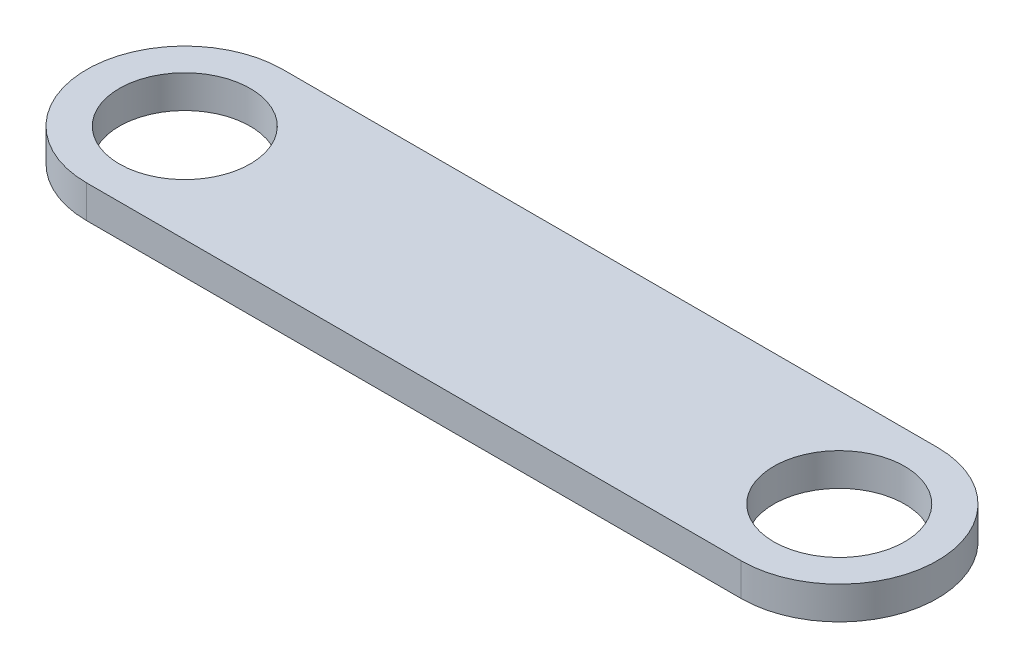
ISO-10303-21;
HEADER;
FILE_DESCRIPTION(('STEP AP214'),'2;1');
FILE_NAME('part.step','',(''),(''),'','','');
FILE_SCHEMA(('AUTOMOTIVE_DESIGN { 1 0 10303 214 1 1 1 1 }'));
ENDSEC;
DATA;
#1=APPLICATION_CONTEXT('core data for automotive mechanical design processes');
#2=APPLICATION_PROTOCOL_DEFINITION('international standard','automotive_design',2000,#1);
#3=PRODUCT_CONTEXT('',#1,'mechanical');
#4=PRODUCT('Part','Part','',(#3));
#5=PRODUCT_RELATED_PRODUCT_CATEGORY('part','',(#4));
#6=PRODUCT_DEFINITION_FORMATION('','',#4);
#7=PRODUCT_DEFINITION_CONTEXT('part definition',#1,'design');
#8=PRODUCT_DEFINITION('design','',#6,#7);
#9=PRODUCT_DEFINITION_SHAPE('','',#8);
#10=(LENGTH_UNIT() NAMED_UNIT(*) SI_UNIT(.MILLI.,.METRE.));
#11=(NAMED_UNIT(*) PLANE_ANGLE_UNIT() SI_UNIT($,.RADIAN.));
#12=(NAMED_UNIT(*) SI_UNIT($,.STERADIAN.) SOLID_ANGLE_UNIT());
#13=UNCERTAINTY_MEASURE_WITH_UNIT(LENGTH_MEASURE(1.E-05),#10,'distance_accuracy_value','');
#14=(GEOMETRIC_REPRESENTATION_CONTEXT(3) GLOBAL_UNCERTAINTY_ASSIGNED_CONTEXT((#13)) GLOBAL_UNIT_ASSIGNED_CONTEXT((#10,
#11,#12)) REPRESENTATION_CONTEXT('',''));
#15=CARTESIAN_POINT('',(0.,0.,0.));
#16=DIRECTION('',(0.,0.,1.));
#17=DIRECTION('',(1.,0.,0.));
#18=AXIS2_PLACEMENT_3D('',#15,#16,#17);
#19=CARTESIAN_POINT('',(0.,5.,15.));
#20=DIRECTION('',(0.,0.,-1.));
#21=DIRECTION('',(-1.,0.,0.));
#22=AXIS2_PLACEMENT_3D('',#19,#20,#21);
#23=PLANE('',#22);
#24=DIRECTION('',(1.,0.,0.));
#25=VECTOR('',#24,1.);
#26=CARTESIAN_POINT('',(0.,0.,15.));
#27=LINE('',#26,#25);
#28=CARTESIAN_POINT('',(0.,0.,15.));
#29=VERTEX_POINT('',#28);
#30=CARTESIAN_POINT('',(100.,0.,15.));
#31=VERTEX_POINT('',#30);
#32=EDGE_CURVE('E123',#29,#31,#27,.T.);
#33=ORIENTED_EDGE('',*,*,#32,.T.);
#34=DIRECTION('',(0.,-1.,0.));
#35=VECTOR('',#34,1.);
#36=CARTESIAN_POINT('',(100.,5.,15.));
#37=LINE('',#36,#35);
#38=CARTESIAN_POINT('',(100.,5.,15.));
#39=VERTEX_POINT('',#38);
#40=EDGE_CURVE('E11',#39,#31,#37,.T.);
#41=ORIENTED_EDGE('',*,*,#40,.F.);
#42=DIRECTION('',(1.,0.,0.));
#43=VECTOR('',#42,1.);
#44=CARTESIAN_POINT('',(0.,5.,15.));
#45=LINE('',#44,#43);
#46=CARTESIAN_POINT('',(0.,5.,15.));
#47=VERTEX_POINT('',#46);
#48=EDGE_CURVE('E96',#47,#39,#45,.T.);
#49=ORIENTED_EDGE('',*,*,#48,.F.);
#50=DIRECTION('',(0.,-1.,0.));
#51=VECTOR('',#50,1.);
#52=CARTESIAN_POINT('',(0.,5.,15.));
#53=LINE('',#52,#51);
#54=EDGE_CURVE('E111',#47,#29,#53,.T.);
#55=ORIENTED_EDGE('',*,*,#54,.T.);
#56=EDGE_LOOP('',(#33,#41,#49,#55));
#57=FACE_BOUND('',#56,.T.);
#58=ADVANCED_FACE('F47',(#57),#23,.F.);
#59=CARTESIAN_POINT('',(100.,5.,0.));
#60=DIRECTION('',(0.,-1.,0.));
#61=DIRECTION('',(0.,0.,-1.));
#62=AXIS2_PLACEMENT_3D('',#59,#60,#61);
#63=CYLINDRICAL_SURFACE('',#62,15.);
#64=CARTESIAN_POINT('',(100.,0.,0.));
#65=DIRECTION('',(0.,1.,0.));
#66=DIRECTION('',(0.,0.,1.));
#67=AXIS2_PLACEMENT_3D('',#64,#65,#66);
#68=CIRCLE('',#67,15.);
#69=CARTESIAN_POINT('',(100.,0.,-15.));
#70=VERTEX_POINT('',#69);
#71=EDGE_CURVE('E102',#31,#70,#68,.T.);
#72=ORIENTED_EDGE('',*,*,#71,.T.);
#73=DIRECTION('',(0.,-1.,0.));
#74=VECTOR('',#73,1.);
#75=CARTESIAN_POINT('',(100.,5.,-15.));
#76=LINE('',#75,#74);
#77=CARTESIAN_POINT('',(100.,5.,-15.));
#78=VERTEX_POINT('',#77);
#79=EDGE_CURVE('E57',#78,#70,#76,.T.);
#80=ORIENTED_EDGE('',*,*,#79,.F.);
#81=CARTESIAN_POINT('',(100.,5.,0.));
#82=DIRECTION('',(0.,1.,0.));
#83=DIRECTION('',(0.,0.,1.));
#84=AXIS2_PLACEMENT_3D('',#81,#82,#83);
#85=CIRCLE('',#84,15.);
#86=EDGE_CURVE('E91',#39,#78,#85,.T.);
#87=ORIENTED_EDGE('',*,*,#86,.F.);
#88=ORIENTED_EDGE('',*,*,#40,.T.);
#89=EDGE_LOOP('',(#72,#80,#87,#88));
#90=FACE_BOUND('',#89,.T.);
#91=ADVANCED_FACE('F101',(#90),#63,.T.);
#92=CARTESIAN_POINT('',(0.,5.,-15.));
#93=DIRECTION('',(0.,0.,-1.));
#94=DIRECTION('',(-1.,0.,0.));
#95=AXIS2_PLACEMENT_3D('',#92,#93,#94);
#96=PLANE('',#95);
#97=DIRECTION('',(1.,0.,0.));
#98=VECTOR('',#97,1.);
#99=CARTESIAN_POINT('',(0.,0.,-15.));
#100=LINE('',#99,#98);
#101=CARTESIAN_POINT('',(0.,0.,-15.));
#102=VERTEX_POINT('',#101);
#103=EDGE_CURVE('E129',#102,#70,#100,.T.);
#104=ORIENTED_EDGE('',*,*,#103,.F.);
#105=DIRECTION('',(0.,-1.,0.));
#106=VECTOR('',#105,1.);
#107=CARTESIAN_POINT('',(0.,5.,-15.));
#108=LINE('',#107,#106);
#109=CARTESIAN_POINT('',(0.,5.,-15.));
#110=VERTEX_POINT('',#109);
#111=EDGE_CURVE('E81',#110,#102,#108,.T.);
#112=ORIENTED_EDGE('',*,*,#111,.F.);
#113=DIRECTION('',(1.,0.,0.));
#114=VECTOR('',#113,1.);
#115=CARTESIAN_POINT('',(0.,5.,-15.));
#116=LINE('',#115,#114);
#117=EDGE_CURVE('E94',#110,#78,#116,.T.);
#118=ORIENTED_EDGE('',*,*,#117,.T.);
#119=ORIENTED_EDGE('',*,*,#79,.T.);
#120=EDGE_LOOP('',(#104,#112,#118,#119));
#121=FACE_BOUND('',#120,.T.);
#122=ADVANCED_FACE('F107',(#121),#96,.T.);
#123=CARTESIAN_POINT('',(0.,5.,0.));
#124=DIRECTION('',(0.,-1.,0.));
#125=DIRECTION('',(0.,0.,-1.));
#126=AXIS2_PLACEMENT_3D('',#123,#124,#125);
#127=CYLINDRICAL_SURFACE('',#126,10.);
#128=CARTESIAN_POINT('',(0.,5.,0.));
#129=DIRECTION('',(0.,1.,0.));
#130=DIRECTION('',(0.,0.,1.));
#131=AXIS2_PLACEMENT_3D('',#128,#129,#130);
#132=CIRCLE('',#131,10.);
#133=CARTESIAN_POINT('',(0.,5.,10.));
#134=VERTEX_POINT('',#133);
#135=EDGE_CURVE('E171',#134,#134,#132,.T.);
#136=ORIENTED_EDGE('',*,*,#135,.T.);
#137=EDGE_LOOP('',(#136));
#138=FACE_BOUND('',#137,.T.);
#139=CARTESIAN_POINT('',(0.,0.,0.));
#140=DIRECTION('',(0.,1.,0.));
#141=DIRECTION('',(0.,0.,1.));
#142=AXIS2_PLACEMENT_3D('',#139,#140,#141);
#143=CIRCLE('',#142,10.);
#144=CARTESIAN_POINT('',(0.,0.,10.));
#145=VERTEX_POINT('',#144);
#146=EDGE_CURVE('E119',#145,#145,#143,.T.);
#147=ORIENTED_EDGE('',*,*,#146,.F.);
#148=EDGE_LOOP('',(#147));
#149=FACE_BOUND('',#148,.T.);
#150=ADVANCED_FACE('F160',(#138,#149),#127,.F.);
#151=CARTESIAN_POINT('',(100.,5.,0.));
#152=DIRECTION('',(0.,-1.,0.));
#153=DIRECTION('',(0.,0.,-1.));
#154=AXIS2_PLACEMENT_3D('',#151,#152,#153);
#155=CYLINDRICAL_SURFACE('',#154,10.);
#156=CARTESIAN_POINT('',(100.,5.,0.));
#157=DIRECTION('',(0.,1.,0.));
#158=DIRECTION('',(0.,0.,1.));
#159=AXIS2_PLACEMENT_3D('',#156,#157,#158);
#160=CIRCLE('',#159,10.);
#161=CARTESIAN_POINT('',(100.,5.,10.));
#162=VERTEX_POINT('',#161);
#163=EDGE_CURVE('E134',#162,#162,#160,.T.);
#164=ORIENTED_EDGE('',*,*,#163,.T.);
#165=EDGE_LOOP('',(#164));
#166=FACE_BOUND('',#165,.T.);
#167=CARTESIAN_POINT('',(100.,0.,0.));
#168=DIRECTION('',(0.,1.,0.));
#169=DIRECTION('',(0.,0.,1.));
#170=AXIS2_PLACEMENT_3D('',#167,#168,#169);
#171=CIRCLE('',#170,10.);
#172=CARTESIAN_POINT('',(100.,0.,10.));
#173=VERTEX_POINT('',#172);
#174=EDGE_CURVE('E115',#173,#173,#171,.T.);
#175=ORIENTED_EDGE('',*,*,#174,.F.);
#176=EDGE_LOOP('',(#175));
#177=FACE_BOUND('',#176,.T.);
#178=ADVANCED_FACE('F49',(#166,#177),#155,.F.);
#179=CARTESIAN_POINT('',(0.,5.,0.));
#180=DIRECTION('',(0.,-1.,0.));
#181=DIRECTION('',(0.,0.,-1.));
#182=AXIS2_PLACEMENT_3D('',#179,#180,#181);
#183=CYLINDRICAL_SURFACE('',#182,15.);
#184=CARTESIAN_POINT('',(0.,0.,0.));
#185=DIRECTION('',(0.,1.,0.));
#186=DIRECTION('',(0.,0.,1.));
#187=AXIS2_PLACEMENT_3D('',#184,#185,#186);
#188=CIRCLE('',#187,15.);
#189=EDGE_CURVE('E84',#102,#29,#188,.T.);
#190=ORIENTED_EDGE('',*,*,#189,.T.);
#191=ORIENTED_EDGE('',*,*,#54,.F.);
#192=CARTESIAN_POINT('',(0.,5.,0.));
#193=DIRECTION('',(0.,1.,0.));
#194=DIRECTION('',(0.,0.,1.));
#195=AXIS2_PLACEMENT_3D('',#192,#193,#194);
#196=CIRCLE('',#195,15.);
#197=EDGE_CURVE('E65',#110,#47,#196,.T.);
#198=ORIENTED_EDGE('',*,*,#197,.F.);
#199=ORIENTED_EDGE('',*,*,#111,.T.);
#200=EDGE_LOOP('',(#190,#191,#198,#199));
#201=FACE_BOUND('',#200,.T.);
#202=ADVANCED_FACE('F148',(#201),#183,.T.);
#203=CARTESIAN_POINT('',(0.,5.,0.));
#204=DIRECTION('',(0.,1.,0.));
#205=DIRECTION('',(0.,0.,1.));
#206=AXIS2_PLACEMENT_3D('',#203,#204,#205);
#207=PLANE('',#206);
#208=ORIENTED_EDGE('',*,*,#163,.F.);
#209=EDGE_LOOP('',(#208));
#210=FACE_BOUND('',#209,.T.);
#211=ORIENTED_EDGE('',*,*,#135,.F.);
#212=EDGE_LOOP('',(#211));
#213=FACE_BOUND('',#212,.T.);
#214=ORIENTED_EDGE('',*,*,#48,.T.);
#215=ORIENTED_EDGE('',*,*,#86,.T.);
#216=ORIENTED_EDGE('',*,*,#117,.F.);
#217=ORIENTED_EDGE('',*,*,#197,.T.);
#218=EDGE_LOOP('',(#214,#215,#216,#217));
#219=FACE_BOUND('',#218,.T.);
#220=ADVANCED_FACE('F92',(#210,#213,#219),#207,.T.);
#221=CARTESIAN_POINT('',(0.,0.,0.));
#222=DIRECTION('',(0.,1.,0.));
#223=DIRECTION('',(0.,0.,1.));
#224=AXIS2_PLACEMENT_3D('',#221,#222,#223);
#225=PLANE('',#224);
#226=ORIENTED_EDGE('',*,*,#174,.T.);
#227=EDGE_LOOP('',(#226));
#228=FACE_BOUND('',#227,.T.);
#229=ORIENTED_EDGE('',*,*,#146,.T.);
#230=EDGE_LOOP('',(#229));
#231=FACE_BOUND('',#230,.T.);
#232=ORIENTED_EDGE('',*,*,#32,.F.);
#233=ORIENTED_EDGE('',*,*,#189,.F.);
#234=ORIENTED_EDGE('',*,*,#103,.T.);
#235=ORIENTED_EDGE('',*,*,#71,.F.);
#236=EDGE_LOOP('',(#232,#233,#234,#235));
#237=FACE_BOUND('',#236,.T.);
#238=ADVANCED_FACE('F141',(#228,#231,#237),#225,.F.);
#239=CLOSED_SHELL('',(#58,#91,#122,#150,#178,#202,#220,#238));
#240=MANIFOLD_SOLID_BREP('B2',#239);
#241=ADVANCED_BREP_SHAPE_REPRESENTATION('',(#18,#240),#14);
#242=SHAPE_DEFINITION_REPRESENTATION(#9,#241);
ENDSEC;
END-ISO-10303-21;
